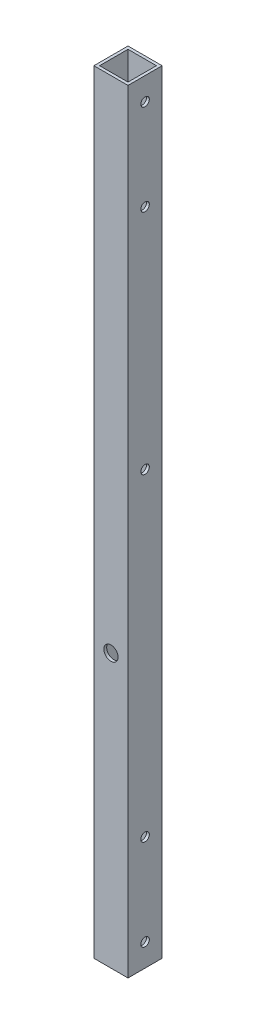
ISO-10303-21;
HEADER;
FILE_DESCRIPTION(('STEP AP214'),'2;1');
FILE_NAME('part.step','',(''),(''),'','','');
FILE_SCHEMA(('AUTOMOTIVE_DESIGN { 1 0 10303 214 1 1 1 1 }'));
ENDSEC;
DATA;
#1=APPLICATION_CONTEXT('core data for automotive mechanical design processes');
#2=APPLICATION_PROTOCOL_DEFINITION('international standard','automotive_design',2000,#1);
#3=PRODUCT_CONTEXT('',#1,'mechanical');
#4=PRODUCT('Part','Part','',(#3));
#5=PRODUCT_RELATED_PRODUCT_CATEGORY('part','',(#4));
#6=PRODUCT_DEFINITION_FORMATION('','',#4);
#7=PRODUCT_DEFINITION_CONTEXT('part definition',#1,'design');
#8=PRODUCT_DEFINITION('design','',#6,#7);
#9=PRODUCT_DEFINITION_SHAPE('','',#8);
#10=(LENGTH_UNIT() NAMED_UNIT(*) SI_UNIT(.MILLI.,.METRE.));
#11=(NAMED_UNIT(*) PLANE_ANGLE_UNIT() SI_UNIT($,.RADIAN.));
#12=(NAMED_UNIT(*) SI_UNIT($,.STERADIAN.) SOLID_ANGLE_UNIT());
#13=UNCERTAINTY_MEASURE_WITH_UNIT(LENGTH_MEASURE(1.E-05),#10,'distance_accuracy_value','');
#14=(GEOMETRIC_REPRESENTATION_CONTEXT(3) GLOBAL_UNCERTAINTY_ASSIGNED_CONTEXT((#13)) GLOBAL_UNIT_ASSIGNED_CONTEXT((#10,
#11,#12)) REPRESENTATION_CONTEXT('',''));
#15=CARTESIAN_POINT('',(0.,0.,0.));
#16=DIRECTION('',(0.,0.,1.));
#17=DIRECTION('',(1.,0.,0.));
#18=AXIS2_PLACEMENT_3D('',#15,#16,#17);
#19=CARTESIAN_POINT('',(0.,431.8,0.));
#20=DIRECTION('',(0.,-1.,0.));
#21=DIRECTION('',(0.,0.,-1.));
#22=AXIS2_PLACEMENT_3D('',#19,#20,#21);
#23=PLANE('',#22);
#24=DIRECTION('',(0.,0.,-1.));
#25=VECTOR('',#24,1.);
#26=CARTESIAN_POINT('',(9.525,431.8,9.525));
#27=LINE('',#26,#25);
#28=CARTESIAN_POINT('',(9.525,431.8,9.525));
#29=VERTEX_POINT('',#28);
#30=CARTESIAN_POINT('',(9.525,431.8,-9.525));
#31=VERTEX_POINT('',#30);
#32=EDGE_CURVE('E138',#29,#31,#27,.T.);
#33=ORIENTED_EDGE('',*,*,#32,.T.);
#34=DIRECTION('',(-1.,0.,0.));
#35=VECTOR('',#34,1.);
#36=CARTESIAN_POINT('',(-9.525,431.8,-9.525));
#37=LINE('',#36,#35);
#38=CARTESIAN_POINT('',(-9.525,431.8,-9.525));
#39=VERTEX_POINT('',#38);
#40=EDGE_CURVE('E141',#31,#39,#37,.T.);
#41=ORIENTED_EDGE('',*,*,#40,.T.);
#42=DIRECTION('',(0.,0.,1.));
#43=VECTOR('',#42,1.);
#44=CARTESIAN_POINT('',(-9.525,431.8,9.525));
#45=LINE('',#44,#43);
#46=CARTESIAN_POINT('',(-9.525,431.8,9.525));
#47=VERTEX_POINT('',#46);
#48=EDGE_CURVE('E144',#39,#47,#45,.T.);
#49=ORIENTED_EDGE('',*,*,#48,.T.);
#50=DIRECTION('',(1.,0.,0.));
#51=VECTOR('',#50,1.);
#52=CARTESIAN_POINT('',(-9.525,431.8,9.525));
#53=LINE('',#52,#51);
#54=EDGE_CURVE('E146',#47,#29,#53,.T.);
#55=ORIENTED_EDGE('',*,*,#54,.T.);
#56=EDGE_LOOP('',(#33,#41,#49,#55));
#57=FACE_BOUND('',#56,.T.);
#58=DIRECTION('',(0.,0.,-1.));
#59=VECTOR('',#58,1.);
#60=CARTESIAN_POINT('',(7.9375,431.8,-7.9375));
#61=LINE('',#60,#59);
#62=CARTESIAN_POINT('',(7.9375,431.8,7.9375));
#63=VERTEX_POINT('',#62);
#64=CARTESIAN_POINT('',(7.9375,431.8,-7.9375));
#65=VERTEX_POINT('',#64);
#66=EDGE_CURVE('E100',#63,#65,#61,.T.);
#67=ORIENTED_EDGE('',*,*,#66,.F.);
#68=DIRECTION('',(1.,0.,0.));
#69=VECTOR('',#68,1.);
#70=CARTESIAN_POINT('',(-7.9375,431.8,7.9375));
#71=LINE('',#70,#69);
#72=CARTESIAN_POINT('',(-7.9375,431.8,7.9375));
#73=VERTEX_POINT('',#72);
#74=EDGE_CURVE('E122',#73,#63,#71,.T.);
#75=ORIENTED_EDGE('',*,*,#74,.F.);
#76=DIRECTION('',(0.,0.,1.));
#77=VECTOR('',#76,1.);
#78=CARTESIAN_POINT('',(-7.9375,431.8,-7.9375));
#79=LINE('',#78,#77);
#80=CARTESIAN_POINT('',(-7.9375,431.8,-7.9375));
#81=VERTEX_POINT('',#80);
#82=EDGE_CURVE('E120',#81,#73,#79,.T.);
#83=ORIENTED_EDGE('',*,*,#82,.F.);
#84=DIRECTION('',(-1.,0.,0.));
#85=VECTOR('',#84,1.);
#86=CARTESIAN_POINT('',(-7.9375,431.8,-7.9375));
#87=LINE('',#86,#85);
#88=EDGE_CURVE('E108',#65,#81,#87,.T.);
#89=ORIENTED_EDGE('',*,*,#88,.F.);
#90=EDGE_LOOP('',(#67,#75,#83,#89));
#91=FACE_BOUND('',#90,.T.);
#92=ADVANCED_FACE('F33',(#57,#91),#23,.F.);
#93=CARTESIAN_POINT('',(0.,0.,0.));
#94=DIRECTION('',(0.,-1.,0.));
#95=DIRECTION('',(0.,0.,-1.));
#96=AXIS2_PLACEMENT_3D('',#93,#94,#95);
#97=PLANE('',#96);
#98=DIRECTION('',(0.,0.,-1.));
#99=VECTOR('',#98,1.);
#100=CARTESIAN_POINT('',(9.525,0.,9.525));
#101=LINE('',#100,#99);
#102=CARTESIAN_POINT('',(9.525,0.,9.525));
#103=VERTEX_POINT('',#102);
#104=CARTESIAN_POINT('',(9.525,0.,-9.525));
#105=VERTEX_POINT('',#104);
#106=EDGE_CURVE('E116',#103,#105,#101,.T.);
#107=ORIENTED_EDGE('',*,*,#106,.F.);
#108=DIRECTION('',(1.,0.,0.));
#109=VECTOR('',#108,1.);
#110=CARTESIAN_POINT('',(-9.525,0.,9.525));
#111=LINE('',#110,#109);
#112=CARTESIAN_POINT('',(-9.525,0.,9.525));
#113=VERTEX_POINT('',#112);
#114=EDGE_CURVE('E142',#113,#103,#111,.T.);
#115=ORIENTED_EDGE('',*,*,#114,.F.);
#116=DIRECTION('',(0.,0.,1.));
#117=VECTOR('',#116,1.);
#118=CARTESIAN_POINT('',(-9.525,0.,9.525));
#119=LINE('',#118,#117);
#120=CARTESIAN_POINT('',(-9.525,0.,-9.525));
#121=VERTEX_POINT('',#120);
#122=EDGE_CURVE('E153',#121,#113,#119,.T.);
#123=ORIENTED_EDGE('',*,*,#122,.F.);
#124=DIRECTION('',(-1.,0.,0.));
#125=VECTOR('',#124,1.);
#126=CARTESIAN_POINT('',(-9.525,0.,-9.525));
#127=LINE('',#126,#125);
#128=EDGE_CURVE('E151',#105,#121,#127,.T.);
#129=ORIENTED_EDGE('',*,*,#128,.F.);
#130=EDGE_LOOP('',(#107,#115,#123,#129));
#131=FACE_BOUND('',#130,.T.);
#132=DIRECTION('',(1.,0.,0.));
#133=VECTOR('',#132,1.);
#134=CARTESIAN_POINT('',(-7.9375,0.,7.9375));
#135=LINE('',#134,#133);
#136=CARTESIAN_POINT('',(-7.9375,0.,7.9375));
#137=VERTEX_POINT('',#136);
#138=CARTESIAN_POINT('',(7.9375,0.,7.9375));
#139=VERTEX_POINT('',#138);
#140=EDGE_CURVE('E109',#137,#139,#135,.T.);
#141=ORIENTED_EDGE('',*,*,#140,.T.);
#142=DIRECTION('',(0.,0.,-1.));
#143=VECTOR('',#142,1.);
#144=CARTESIAN_POINT('',(7.9375,0.,-7.9375));
#145=LINE('',#144,#143);
#146=CARTESIAN_POINT('',(7.9375,0.,-7.9375));
#147=VERTEX_POINT('',#146);
#148=EDGE_CURVE('E58',#139,#147,#145,.T.);
#149=ORIENTED_EDGE('',*,*,#148,.T.);
#150=DIRECTION('',(-1.,0.,0.));
#151=VECTOR('',#150,1.);
#152=CARTESIAN_POINT('',(-7.9375,0.,-7.9375));
#153=LINE('',#152,#151);
#154=CARTESIAN_POINT('',(-7.9375,0.,-7.9375));
#155=VERTEX_POINT('',#154);
#156=EDGE_CURVE('E115',#147,#155,#153,.T.);
#157=ORIENTED_EDGE('',*,*,#156,.T.);
#158=DIRECTION('',(0.,0.,1.));
#159=VECTOR('',#158,1.);
#160=CARTESIAN_POINT('',(-7.9375,0.,-7.9375));
#161=LINE('',#160,#159);
#162=EDGE_CURVE('E130',#155,#137,#161,.T.);
#163=ORIENTED_EDGE('',*,*,#162,.T.);
#164=EDGE_LOOP('',(#141,#149,#157,#163));
#165=FACE_BOUND('',#164,.T.);
#166=ADVANCED_FACE('F221',(#131,#165),#97,.T.);
#167=CARTESIAN_POINT('',(9.525,431.8,9.525));
#168=DIRECTION('',(-1.,0.,0.));
#169=DIRECTION('',(0.,0.,1.));
#170=AXIS2_PLACEMENT_3D('',#167,#168,#169);
#171=PLANE('',#170);
#172=CARTESIAN_POINT('',(9.525,12.7,0.));
#173=DIRECTION('',(1.,0.,0.));
#174=DIRECTION('',(0.,0.,-1.));
#175=AXIS2_PLACEMENT_3D('',#172,#173,#174);
#176=CIRCLE('',#175,2.38125);
#177=CARTESIAN_POINT('',(9.525,12.7,-2.38125));
#178=VERTEX_POINT('',#177);
#179=EDGE_CURVE('E293',#178,#178,#176,.T.);
#180=ORIENTED_EDGE('',*,*,#179,.F.);
#181=EDGE_LOOP('',(#180));
#182=FACE_BOUND('',#181,.T.);
#183=CARTESIAN_POINT('',(9.525,63.5,0.));
#184=DIRECTION('',(1.,0.,0.));
#185=DIRECTION('',(0.,0.,-1.));
#186=AXIS2_PLACEMENT_3D('',#183,#184,#185);
#187=CIRCLE('',#186,2.38125);
#188=CARTESIAN_POINT('',(9.525,63.5,-2.38125));
#189=VERTEX_POINT('',#188);
#190=EDGE_CURVE('E299',#189,#189,#187,.T.);
#191=ORIENTED_EDGE('',*,*,#190,.F.);
#192=EDGE_LOOP('',(#191));
#193=FACE_BOUND('',#192,.T.);
#194=CARTESIAN_POINT('',(9.525,241.3,0.));
#195=DIRECTION('',(1.,0.,0.));
#196=DIRECTION('',(0.,0.,-1.));
#197=AXIS2_PLACEMENT_3D('',#194,#195,#196);
#198=CIRCLE('',#197,2.38125);
#199=CARTESIAN_POINT('',(9.525,241.3,-2.38125));
#200=VERTEX_POINT('',#199);
#201=EDGE_CURVE('E305',#200,#200,#198,.T.);
#202=ORIENTED_EDGE('',*,*,#201,.F.);
#203=EDGE_LOOP('',(#202));
#204=FACE_BOUND('',#203,.T.);
#205=CARTESIAN_POINT('',(9.525,368.3,0.));
#206=DIRECTION('',(1.,0.,0.));
#207=DIRECTION('',(0.,0.,-1.));
#208=AXIS2_PLACEMENT_3D('',#205,#206,#207);
#209=CIRCLE('',#208,2.38125000000001);
#210=CARTESIAN_POINT('',(9.525,368.3,-2.38125000000001));
#211=VERTEX_POINT('',#210);
#212=EDGE_CURVE('E311',#211,#211,#209,.T.);
#213=ORIENTED_EDGE('',*,*,#212,.F.);
#214=EDGE_LOOP('',(#213));
#215=FACE_BOUND('',#214,.T.);
#216=CARTESIAN_POINT('',(9.525,419.1,0.));
#217=DIRECTION('',(1.,0.,0.));
#218=DIRECTION('',(0.,0.,-1.));
#219=AXIS2_PLACEMENT_3D('',#216,#217,#218);
#220=CIRCLE('',#219,2.38125000000001);
#221=CARTESIAN_POINT('',(9.525,419.1,-2.38125000000001));
#222=VERTEX_POINT('',#221);
#223=EDGE_CURVE('E317',#222,#222,#220,.T.);
#224=ORIENTED_EDGE('',*,*,#223,.F.);
#225=EDGE_LOOP('',(#224));
#226=FACE_BOUND('',#225,.T.);
#227=ORIENTED_EDGE('',*,*,#106,.T.);
#228=DIRECTION('',(0.,-1.,0.));
#229=VECTOR('',#228,1.);
#230=CARTESIAN_POINT('',(9.525,431.8,-9.525));
#231=LINE('',#230,#229);
#232=EDGE_CURVE('E11',#31,#105,#231,.T.);
#233=ORIENTED_EDGE('',*,*,#232,.F.);
#234=ORIENTED_EDGE('',*,*,#32,.F.);
#235=DIRECTION('',(0.,-1.,0.));
#236=VECTOR('',#235,1.);
#237=CARTESIAN_POINT('',(9.525,431.8,9.525));
#238=LINE('',#237,#236);
#239=EDGE_CURVE('E148',#29,#103,#238,.T.);
#240=ORIENTED_EDGE('',*,*,#239,.T.);
#241=EDGE_LOOP('',(#227,#233,#234,#240));
#242=FACE_BOUND('',#241,.T.);
#243=ADVANCED_FACE('F35',(#182,#193,#204,#215,#226,#242),#171,.F.);
#244=CARTESIAN_POINT('',(-9.525,431.8,-9.525));
#245=DIRECTION('',(0.,0.,1.));
#246=DIRECTION('',(1.,0.,0.));
#247=AXIS2_PLACEMENT_3D('',#244,#245,#246);
#248=PLANE('',#247);
#249=ORIENTED_EDGE('',*,*,#128,.T.);
#250=DIRECTION('',(0.,-1.,0.));
#251=VECTOR('',#250,1.);
#252=CARTESIAN_POINT('',(-9.525,431.8,-9.525));
#253=LINE('',#252,#251);
#254=EDGE_CURVE('E42',#39,#121,#253,.T.);
#255=ORIENTED_EDGE('',*,*,#254,.F.);
#256=ORIENTED_EDGE('',*,*,#40,.F.);
#257=ORIENTED_EDGE('',*,*,#232,.T.);
#258=EDGE_LOOP('',(#249,#255,#256,#257));
#259=FACE_BOUND('',#258,.T.);
#260=ADVANCED_FACE('F225',(#259),#248,.F.);
#261=CARTESIAN_POINT('',(-9.525,431.8,9.525));
#262=DIRECTION('',(1.,0.,0.));
#263=DIRECTION('',(0.,0.,-1.));
#264=AXIS2_PLACEMENT_3D('',#261,#262,#263);
#265=PLANE('',#264);
#266=CARTESIAN_POINT('',(-9.525,12.7,0.));
#267=DIRECTION('',(1.,0.,0.));
#268=DIRECTION('',(0.,0.,-1.));
#269=AXIS2_PLACEMENT_3D('',#266,#267,#268);
#270=CIRCLE('',#269,2.38125);
#271=CARTESIAN_POINT('',(-9.525,12.7,-2.38125));
#272=VERTEX_POINT('',#271);
#273=EDGE_CURVE('E167',#272,#272,#270,.T.);
#274=ORIENTED_EDGE('',*,*,#273,.T.);
#275=EDGE_LOOP('',(#274));
#276=FACE_BOUND('',#275,.T.);
#277=CARTESIAN_POINT('',(-9.525,63.5,0.));
#278=DIRECTION('',(1.,0.,0.));
#279=DIRECTION('',(0.,0.,-1.));
#280=AXIS2_PLACEMENT_3D('',#277,#278,#279);
#281=CIRCLE('',#280,2.38125);
#282=CARTESIAN_POINT('',(-9.525,63.5,-2.38125));
#283=VERTEX_POINT('',#282);
#284=EDGE_CURVE('E295',#283,#283,#281,.T.);
#285=ORIENTED_EDGE('',*,*,#284,.T.);
#286=EDGE_LOOP('',(#285));
#287=FACE_BOUND('',#286,.T.);
#288=CARTESIAN_POINT('',(-9.525,241.3,0.));
#289=DIRECTION('',(1.,0.,0.));
#290=DIRECTION('',(0.,0.,-1.));
#291=AXIS2_PLACEMENT_3D('',#288,#289,#290);
#292=CIRCLE('',#291,2.38125);
#293=CARTESIAN_POINT('',(-9.525,241.3,-2.38125));
#294=VERTEX_POINT('',#293);
#295=EDGE_CURVE('E303',#294,#294,#292,.T.);
#296=ORIENTED_EDGE('',*,*,#295,.T.);
#297=EDGE_LOOP('',(#296));
#298=FACE_BOUND('',#297,.T.);
#299=CARTESIAN_POINT('',(-9.525,368.3,0.));
#300=DIRECTION('',(1.,0.,0.));
#301=DIRECTION('',(0.,0.,-1.));
#302=AXIS2_PLACEMENT_3D('',#299,#300,#301);
#303=CIRCLE('',#302,2.38125000000001);
#304=CARTESIAN_POINT('',(-9.525,368.3,-2.38125000000001));
#305=VERTEX_POINT('',#304);
#306=EDGE_CURVE('E308',#305,#305,#303,.T.);
#307=ORIENTED_EDGE('',*,*,#306,.T.);
#308=EDGE_LOOP('',(#307));
#309=FACE_BOUND('',#308,.T.);
#310=CARTESIAN_POINT('',(-9.525,419.1,0.));
#311=DIRECTION('',(1.,0.,0.));
#312=DIRECTION('',(0.,0.,-1.));
#313=AXIS2_PLACEMENT_3D('',#310,#311,#312);
#314=CIRCLE('',#313,2.38125000000001);
#315=CARTESIAN_POINT('',(-9.525,419.1,-2.38125000000001));
#316=VERTEX_POINT('',#315);
#317=EDGE_CURVE('E314',#316,#316,#314,.T.);
#318=ORIENTED_EDGE('',*,*,#317,.T.);
#319=EDGE_LOOP('',(#318));
#320=FACE_BOUND('',#319,.T.);
#321=ORIENTED_EDGE('',*,*,#122,.T.);
#322=DIRECTION('',(0.,-1.,0.));
#323=VECTOR('',#322,1.);
#324=CARTESIAN_POINT('',(-9.525,431.8,9.525));
#325=LINE('',#324,#323);
#326=EDGE_CURVE('E158',#47,#113,#325,.T.);
#327=ORIENTED_EDGE('',*,*,#326,.F.);
#328=ORIENTED_EDGE('',*,*,#48,.F.);
#329=ORIENTED_EDGE('',*,*,#254,.T.);
#330=EDGE_LOOP('',(#321,#327,#328,#329));
#331=FACE_BOUND('',#330,.T.);
#332=ADVANCED_FACE('F209',(#276,#287,#298,#309,#320,#331),#265,.F.);
#333=CARTESIAN_POINT('',(-9.525,431.8,9.525));
#334=DIRECTION('',(0.,0.,-1.));
#335=DIRECTION('',(-1.,0.,0.));
#336=AXIS2_PLACEMENT_3D('',#333,#334,#335);
#337=PLANE('',#336);
#338=CARTESIAN_POINT('',(0.,152.4,9.525));
#339=DIRECTION('',(0.,0.,1.));
#340=DIRECTION('',(1.,0.,0.));
#341=AXIS2_PLACEMENT_3D('',#338,#339,#340);
#342=CIRCLE('',#341,3.96875);
#343=CARTESIAN_POINT('',(3.96875,152.4,9.525));
#344=VERTEX_POINT('',#343);
#345=EDGE_CURVE('E128',#344,#344,#342,.T.);
#346=ORIENTED_EDGE('',*,*,#345,.F.);
#347=EDGE_LOOP('',(#346));
#348=FACE_BOUND('',#347,.T.);
#349=ORIENTED_EDGE('',*,*,#114,.T.);
#350=ORIENTED_EDGE('',*,*,#239,.F.);
#351=ORIENTED_EDGE('',*,*,#54,.F.);
#352=ORIENTED_EDGE('',*,*,#326,.T.);
#353=EDGE_LOOP('',(#349,#350,#351,#352));
#354=FACE_BOUND('',#353,.T.);
#355=ADVANCED_FACE('F206',(#348,#354),#337,.F.);
#356=CARTESIAN_POINT('',(7.9375,431.8,-7.9375));
#357=DIRECTION('',(-1.,0.,0.));
#358=DIRECTION('',(0.,0.,1.));
#359=AXIS2_PLACEMENT_3D('',#356,#357,#358);
#360=PLANE('',#359);
#361=CARTESIAN_POINT('',(7.9375,12.7,0.));
#362=DIRECTION('',(-1.,0.,0.));
#363=DIRECTION('',(0.,0.,1.));
#364=AXIS2_PLACEMENT_3D('',#361,#362,#363);
#365=CIRCLE('',#364,2.38125);
#366=CARTESIAN_POINT('',(7.9375,12.7,2.38125));
#367=VERTEX_POINT('',#366);
#368=EDGE_CURVE('E189',#367,#367,#365,.T.);
#369=ORIENTED_EDGE('',*,*,#368,.F.);
#370=EDGE_LOOP('',(#369));
#371=FACE_BOUND('',#370,.T.);
#372=CARTESIAN_POINT('',(7.9375,63.5,0.));
#373=DIRECTION('',(-1.,0.,0.));
#374=DIRECTION('',(0.,0.,1.));
#375=AXIS2_PLACEMENT_3D('',#372,#373,#374);
#376=CIRCLE('',#375,2.38125);
#377=CARTESIAN_POINT('',(7.9375,63.5,2.38125));
#378=VERTEX_POINT('',#377);
#379=EDGE_CURVE('E177',#378,#378,#376,.T.);
#380=ORIENTED_EDGE('',*,*,#379,.F.);
#381=EDGE_LOOP('',(#380));
#382=FACE_BOUND('',#381,.T.);
#383=CARTESIAN_POINT('',(7.9375,241.3,0.));
#384=DIRECTION('',(-1.,0.,0.));
#385=DIRECTION('',(0.,0.,1.));
#386=AXIS2_PLACEMENT_3D('',#383,#384,#385);
#387=CIRCLE('',#386,2.38125);
#388=CARTESIAN_POINT('',(7.9375,241.3,2.38125));
#389=VERTEX_POINT('',#388);
#390=EDGE_CURVE('E174',#389,#389,#387,.T.);
#391=ORIENTED_EDGE('',*,*,#390,.F.);
#392=EDGE_LOOP('',(#391));
#393=FACE_BOUND('',#392,.T.);
#394=CARTESIAN_POINT('',(7.9375,368.3,0.));
#395=DIRECTION('',(-1.,0.,0.));
#396=DIRECTION('',(0.,0.,1.));
#397=AXIS2_PLACEMENT_3D('',#394,#395,#396);
#398=CIRCLE('',#397,2.38125000000001);
#399=CARTESIAN_POINT('',(7.9375,368.3,2.38125000000001));
#400=VERTEX_POINT('',#399);
#401=EDGE_CURVE('E171',#400,#400,#398,.T.);
#402=ORIENTED_EDGE('',*,*,#401,.F.);
#403=EDGE_LOOP('',(#402));
#404=FACE_BOUND('',#403,.T.);
#405=CARTESIAN_POINT('',(7.9375,419.1,0.));
#406=DIRECTION('',(-1.,0.,0.));
#407=DIRECTION('',(0.,0.,1.));
#408=AXIS2_PLACEMENT_3D('',#405,#406,#407);
#409=CIRCLE('',#408,2.38125000000001);
#410=CARTESIAN_POINT('',(7.9375,419.1,2.38125000000001));
#411=VERTEX_POINT('',#410);
#412=EDGE_CURVE('E166',#411,#411,#409,.T.);
#413=ORIENTED_EDGE('',*,*,#412,.F.);
#414=EDGE_LOOP('',(#413));
#415=FACE_BOUND('',#414,.T.);
#416=ORIENTED_EDGE('',*,*,#148,.F.);
#417=DIRECTION('',(0.,-1.,0.));
#418=VECTOR('',#417,1.);
#419=CARTESIAN_POINT('',(7.9375,431.8,7.9375));
#420=LINE('',#419,#418);
#421=EDGE_CURVE('E104',#63,#139,#420,.T.);
#422=ORIENTED_EDGE('',*,*,#421,.F.);
#423=ORIENTED_EDGE('',*,*,#66,.T.);
#424=DIRECTION('',(0.,-1.,0.));
#425=VECTOR('',#424,1.);
#426=CARTESIAN_POINT('',(7.9375,431.8,-7.9375));
#427=LINE('',#426,#425);
#428=EDGE_CURVE('E103',#65,#147,#427,.T.);
#429=ORIENTED_EDGE('',*,*,#428,.T.);
#430=EDGE_LOOP('',(#416,#422,#423,#429));
#431=FACE_BOUND('',#430,.T.);
#432=ADVANCED_FACE('F102',(#371,#382,#393,#404,#415,#431),#360,.T.);
#433=CARTESIAN_POINT('',(-7.9375,431.8,-7.9375));
#434=DIRECTION('',(0.,0.,1.));
#435=DIRECTION('',(1.,0.,0.));
#436=AXIS2_PLACEMENT_3D('',#433,#434,#435);
#437=PLANE('',#436);
#438=ORIENTED_EDGE('',*,*,#156,.F.);
#439=ORIENTED_EDGE('',*,*,#428,.F.);
#440=ORIENTED_EDGE('',*,*,#88,.T.);
#441=DIRECTION('',(0.,-1.,0.));
#442=VECTOR('',#441,1.);
#443=CARTESIAN_POINT('',(-7.9375,431.8,-7.9375));
#444=LINE('',#443,#442);
#445=EDGE_CURVE('E117',#81,#155,#444,.T.);
#446=ORIENTED_EDGE('',*,*,#445,.T.);
#447=EDGE_LOOP('',(#438,#439,#440,#446));
#448=FACE_BOUND('',#447,.T.);
#449=ADVANCED_FACE('F112',(#448),#437,.T.);
#450=CARTESIAN_POINT('',(-7.9375,431.8,-7.9375));
#451=DIRECTION('',(1.,0.,0.));
#452=DIRECTION('',(0.,0.,-1.));
#453=AXIS2_PLACEMENT_3D('',#450,#451,#452);
#454=PLANE('',#453);
#455=CARTESIAN_POINT('',(-7.9375,12.7,0.));
#456=DIRECTION('',(1.,0.,0.));
#457=DIRECTION('',(0.,0.,-1.));
#458=AXIS2_PLACEMENT_3D('',#455,#456,#457);
#459=CIRCLE('',#458,2.38125);
#460=CARTESIAN_POINT('',(-7.9375,12.7,-2.38125));
#461=VERTEX_POINT('',#460);
#462=EDGE_CURVE('E37',#461,#461,#459,.T.);
#463=ORIENTED_EDGE('',*,*,#462,.F.);
#464=EDGE_LOOP('',(#463));
#465=FACE_BOUND('',#464,.T.);
#466=CARTESIAN_POINT('',(-7.9375,63.5,0.));
#467=DIRECTION('',(1.,0.,0.));
#468=DIRECTION('',(0.,0.,-1.));
#469=AXIS2_PLACEMENT_3D('',#466,#467,#468);
#470=CIRCLE('',#469,2.38125);
#471=CARTESIAN_POINT('',(-7.9375,63.5,-2.38125));
#472=VERTEX_POINT('',#471);
#473=EDGE_CURVE('E175',#472,#472,#470,.T.);
#474=ORIENTED_EDGE('',*,*,#473,.F.);
#475=EDGE_LOOP('',(#474));
#476=FACE_BOUND('',#475,.T.);
#477=CARTESIAN_POINT('',(-7.9375,241.3,0.));
#478=DIRECTION('',(1.,0.,0.));
#479=DIRECTION('',(0.,0.,-1.));
#480=AXIS2_PLACEMENT_3D('',#477,#478,#479);
#481=CIRCLE('',#480,2.38125);
#482=CARTESIAN_POINT('',(-7.9375,241.3,-2.38125));
#483=VERTEX_POINT('',#482);
#484=EDGE_CURVE('E172',#483,#483,#481,.T.);
#485=ORIENTED_EDGE('',*,*,#484,.F.);
#486=EDGE_LOOP('',(#485));
#487=FACE_BOUND('',#486,.T.);
#488=CARTESIAN_POINT('',(-7.9375,368.3,0.));
#489=DIRECTION('',(1.,0.,0.));
#490=DIRECTION('',(0.,0.,-1.));
#491=AXIS2_PLACEMENT_3D('',#488,#489,#490);
#492=CIRCLE('',#491,2.38125000000001);
#493=CARTESIAN_POINT('',(-7.9375,368.3,-2.38125000000001));
#494=VERTEX_POINT('',#493);
#495=EDGE_CURVE('E168',#494,#494,#492,.T.);
#496=ORIENTED_EDGE('',*,*,#495,.F.);
#497=EDGE_LOOP('',(#496));
#498=FACE_BOUND('',#497,.T.);
#499=CARTESIAN_POINT('',(-7.9375,419.1,0.));
#500=DIRECTION('',(1.,0.,0.));
#501=DIRECTION('',(0.,0.,-1.));
#502=AXIS2_PLACEMENT_3D('',#499,#500,#501);
#503=CIRCLE('',#502,2.38125000000001);
#504=CARTESIAN_POINT('',(-7.9375,419.1,-2.38125000000001));
#505=VERTEX_POINT('',#504);
#506=EDGE_CURVE('E163',#505,#505,#503,.T.);
#507=ORIENTED_EDGE('',*,*,#506,.F.);
#508=EDGE_LOOP('',(#507));
#509=FACE_BOUND('',#508,.T.);
#510=ORIENTED_EDGE('',*,*,#162,.F.);
#511=ORIENTED_EDGE('',*,*,#445,.F.);
#512=ORIENTED_EDGE('',*,*,#82,.T.);
#513=DIRECTION('',(0.,-1.,0.));
#514=VECTOR('',#513,1.);
#515=CARTESIAN_POINT('',(-7.9375,431.8,7.9375));
#516=LINE('',#515,#514);
#517=EDGE_CURVE('E50',#73,#137,#516,.T.);
#518=ORIENTED_EDGE('',*,*,#517,.T.);
#519=EDGE_LOOP('',(#510,#511,#512,#518));
#520=FACE_BOUND('',#519,.T.);
#521=ADVANCED_FACE('F249',(#465,#476,#487,#498,#509,#520),#454,.T.);
#522=CARTESIAN_POINT('',(-7.9375,431.8,7.9375));
#523=DIRECTION('',(0.,0.,-1.));
#524=DIRECTION('',(-1.,0.,0.));
#525=AXIS2_PLACEMENT_3D('',#522,#523,#524);
#526=PLANE('',#525);
#527=CARTESIAN_POINT('',(0.,152.4,7.9375));
#528=DIRECTION('',(0.,0.,-1.));
#529=DIRECTION('',(-1.,0.,0.));
#530=AXIS2_PLACEMENT_3D('',#527,#528,#529);
#531=CIRCLE('',#530,3.96875);
#532=CARTESIAN_POINT('',(-3.96875,152.4,7.9375));
#533=VERTEX_POINT('',#532);
#534=EDGE_CURVE('E192',#533,#533,#531,.F.);
#535=ORIENTED_EDGE('',*,*,#534,.T.);
#536=EDGE_LOOP('',(#535));
#537=FACE_BOUND('',#536,.T.);
#538=ORIENTED_EDGE('',*,*,#140,.F.);
#539=ORIENTED_EDGE('',*,*,#517,.F.);
#540=ORIENTED_EDGE('',*,*,#74,.T.);
#541=ORIENTED_EDGE('',*,*,#421,.T.);
#542=EDGE_LOOP('',(#538,#539,#540,#541));
#543=FACE_BOUND('',#542,.T.);
#544=ADVANCED_FACE('F197',(#537,#543),#526,.T.);
#545=CARTESIAN_POINT('',(0.,152.4,-9.526));
#546=DIRECTION('',(0.,0.,1.));
#547=DIRECTION('',(1.,0.,0.));
#548=AXIS2_PLACEMENT_3D('',#545,#546,#547);
#549=CYLINDRICAL_SURFACE('',#548,3.96875);
#550=ORIENTED_EDGE('',*,*,#534,.F.);
#551=EDGE_LOOP('',(#550));
#552=FACE_BOUND('',#551,.T.);
#553=ORIENTED_EDGE('',*,*,#345,.T.);
#554=EDGE_LOOP('',(#553));
#555=FACE_BOUND('',#554,.T.);
#556=ADVANCED_FACE('F199',(#552,#555),#549,.F.);
#557=CARTESIAN_POINT('',(-9.525,419.1,0.));
#558=DIRECTION('',(1.,0.,0.));
#559=DIRECTION('',(0.,0.,-1.));
#560=AXIS2_PLACEMENT_3D('',#557,#558,#559);
#561=CYLINDRICAL_SURFACE('',#560,2.38125000000001);
#562=ORIENTED_EDGE('',*,*,#506,.T.);
#563=EDGE_LOOP('',(#562));
#564=FACE_BOUND('',#563,.T.);
#565=ORIENTED_EDGE('',*,*,#317,.F.);
#566=EDGE_LOOP('',(#565));
#567=FACE_BOUND('',#566,.T.);
#568=ADVANCED_FACE('F202',(#564,#567),#561,.F.);
#569=CARTESIAN_POINT('',(-9.525,368.3,0.));
#570=DIRECTION('',(1.,0.,0.));
#571=DIRECTION('',(0.,0.,-1.));
#572=AXIS2_PLACEMENT_3D('',#569,#570,#571);
#573=CYLINDRICAL_SURFACE('',#572,2.38125000000001);
#574=ORIENTED_EDGE('',*,*,#495,.T.);
#575=EDGE_LOOP('',(#574));
#576=FACE_BOUND('',#575,.T.);
#577=ORIENTED_EDGE('',*,*,#306,.F.);
#578=EDGE_LOOP('',(#577));
#579=FACE_BOUND('',#578,.T.);
#580=ADVANCED_FACE('F257',(#576,#579),#573,.F.);
#581=CARTESIAN_POINT('',(-9.525,241.3,0.));
#582=DIRECTION('',(1.,0.,0.));
#583=DIRECTION('',(0.,0.,-1.));
#584=AXIS2_PLACEMENT_3D('',#581,#582,#583);
#585=CYLINDRICAL_SURFACE('',#584,2.38125);
#586=ORIENTED_EDGE('',*,*,#484,.T.);
#587=EDGE_LOOP('',(#586));
#588=FACE_BOUND('',#587,.T.);
#589=ORIENTED_EDGE('',*,*,#295,.F.);
#590=EDGE_LOOP('',(#589));
#591=FACE_BOUND('',#590,.T.);
#592=ADVANCED_FACE('F262',(#588,#591),#585,.F.);
#593=CARTESIAN_POINT('',(-9.525,63.5,0.));
#594=DIRECTION('',(1.,0.,0.));
#595=DIRECTION('',(0.,0.,-1.));
#596=AXIS2_PLACEMENT_3D('',#593,#594,#595);
#597=CYLINDRICAL_SURFACE('',#596,2.38125);
#598=ORIENTED_EDGE('',*,*,#473,.T.);
#599=EDGE_LOOP('',(#598));
#600=FACE_BOUND('',#599,.T.);
#601=ORIENTED_EDGE('',*,*,#284,.F.);
#602=EDGE_LOOP('',(#601));
#603=FACE_BOUND('',#602,.T.);
#604=ADVANCED_FACE('F267',(#600,#603),#597,.F.);
#605=CARTESIAN_POINT('',(-9.525,12.7,0.));
#606=DIRECTION('',(1.,0.,0.));
#607=DIRECTION('',(0.,0.,-1.));
#608=AXIS2_PLACEMENT_3D('',#605,#606,#607);
#609=CYLINDRICAL_SURFACE('',#608,2.38125);
#610=ORIENTED_EDGE('',*,*,#462,.T.);
#611=EDGE_LOOP('',(#610));
#612=FACE_BOUND('',#611,.T.);
#613=ORIENTED_EDGE('',*,*,#273,.F.);
#614=EDGE_LOOP('',(#613));
#615=FACE_BOUND('',#614,.T.);
#616=ADVANCED_FACE('F272',(#612,#615),#609,.F.);
#617=ORIENTED_EDGE('',*,*,#412,.T.);
#618=EDGE_LOOP('',(#617));
#619=FACE_BOUND('',#618,.T.);
#620=ORIENTED_EDGE('',*,*,#223,.T.);
#621=EDGE_LOOP('',(#620));
#622=FACE_BOUND('',#621,.T.);
#623=ADVANCED_FACE('F259',(#619,#622),#561,.F.);
#624=ORIENTED_EDGE('',*,*,#401,.T.);
#625=EDGE_LOOP('',(#624));
#626=FACE_BOUND('',#625,.T.);
#627=ORIENTED_EDGE('',*,*,#212,.T.);
#628=EDGE_LOOP('',(#627));
#629=FACE_BOUND('',#628,.T.);
#630=ADVANCED_FACE('F264',(#626,#629),#573,.F.);
#631=ORIENTED_EDGE('',*,*,#390,.T.);
#632=EDGE_LOOP('',(#631));
#633=FACE_BOUND('',#632,.T.);
#634=ORIENTED_EDGE('',*,*,#201,.T.);
#635=EDGE_LOOP('',(#634));
#636=FACE_BOUND('',#635,.T.);
#637=ADVANCED_FACE('F269',(#633,#636),#585,.F.);
#638=ORIENTED_EDGE('',*,*,#379,.T.);
#639=EDGE_LOOP('',(#638));
#640=FACE_BOUND('',#639,.T.);
#641=ORIENTED_EDGE('',*,*,#190,.T.);
#642=EDGE_LOOP('',(#641));
#643=FACE_BOUND('',#642,.T.);
#644=ADVANCED_FACE('F273',(#640,#643),#597,.F.);
#645=ORIENTED_EDGE('',*,*,#368,.T.);
#646=EDGE_LOOP('',(#645));
#647=FACE_BOUND('',#646,.T.);
#648=ORIENTED_EDGE('',*,*,#179,.T.);
#649=EDGE_LOOP('',(#648));
#650=FACE_BOUND('',#649,.T.);
#651=ADVANCED_FACE('F276',(#647,#650),#609,.F.);
#652=CLOSED_SHELL('',(#92,#166,#243,#260,#332,#355,#432,#449,#521,#544,#556,#568,#580,#592,#604,
#616,#623,#630,#637,#644,#651));
#653=MANIFOLD_SOLID_BREP('B2',#652);
#654=ADVANCED_BREP_SHAPE_REPRESENTATION('',(#18,#653),#14);
#655=SHAPE_DEFINITION_REPRESENTATION(#9,#654);
ENDSEC;
END-ISO-10303-21;
